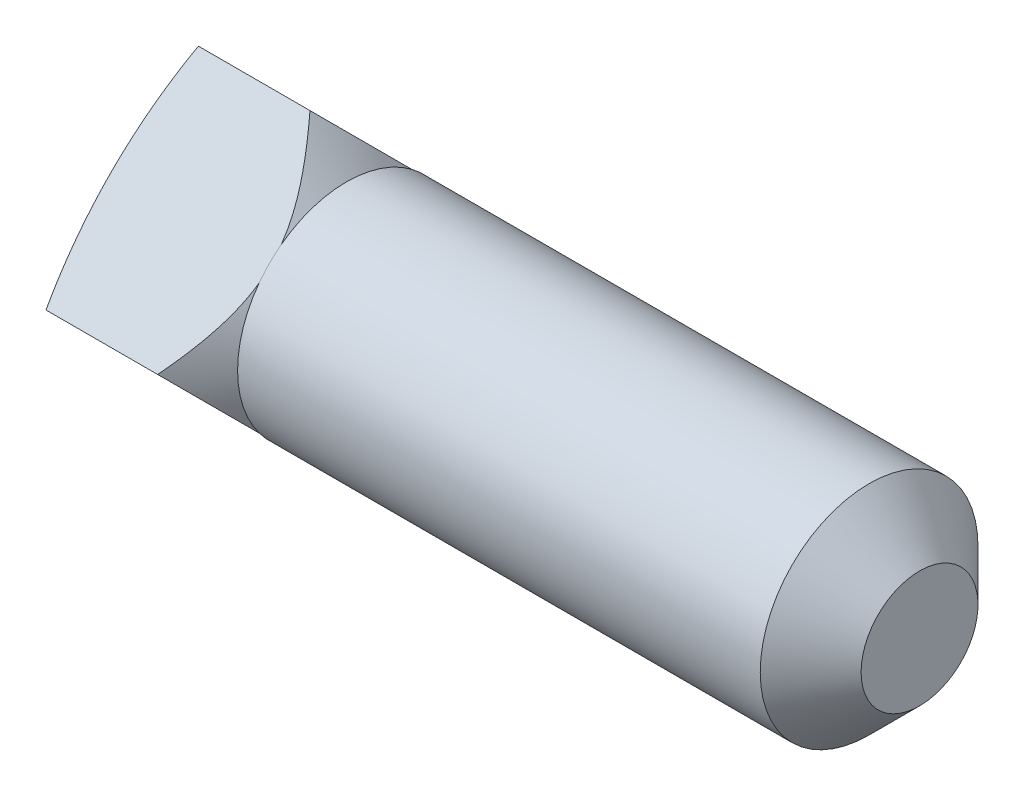
ISO-10303-21;
HEADER;
FILE_DESCRIPTION(('STEP AP214'),'2;1');
FILE_NAME('part.step','',(''),(''),'','','');
FILE_SCHEMA(('AUTOMOTIVE_DESIGN { 1 0 10303 214 1 1 1 1 }'));
ENDSEC;
DATA;
#1=APPLICATION_CONTEXT('core data for automotive mechanical design processes');
#2=APPLICATION_PROTOCOL_DEFINITION('international standard','automotive_design',2000,#1);
#3=PRODUCT_CONTEXT('',#1,'mechanical');
#4=PRODUCT('Part','Part','',(#3));
#5=PRODUCT_RELATED_PRODUCT_CATEGORY('part','',(#4));
#6=PRODUCT_DEFINITION_FORMATION('','',#4);
#7=PRODUCT_DEFINITION_CONTEXT('part definition',#1,'design');
#8=PRODUCT_DEFINITION('design','',#6,#7);
#9=PRODUCT_DEFINITION_SHAPE('','',#8);
#10=(LENGTH_UNIT() NAMED_UNIT(*) SI_UNIT(.MILLI.,.METRE.));
#11=(NAMED_UNIT(*) PLANE_ANGLE_UNIT() SI_UNIT($,.RADIAN.));
#12=(NAMED_UNIT(*) SI_UNIT($,.STERADIAN.) SOLID_ANGLE_UNIT());
#13=UNCERTAINTY_MEASURE_WITH_UNIT(LENGTH_MEASURE(1.E-05),#10,'distance_accuracy_value','');
#14=(GEOMETRIC_REPRESENTATION_CONTEXT(3) GLOBAL_UNCERTAINTY_ASSIGNED_CONTEXT((#13)) GLOBAL_UNIT_ASSIGNED_CONTEXT((#10,
#11,#12)) REPRESENTATION_CONTEXT('',''));
#15=CARTESIAN_POINT('',(0.,0.,0.));
#16=DIRECTION('',(0.,0.,1.));
#17=DIRECTION('',(1.,0.,0.));
#18=AXIS2_PLACEMENT_3D('',#15,#16,#17);
#19=CARTESIAN_POINT('',(-3.7592,0.,-3.376576301522));
#20=DIRECTION('',(0.,-0.707106781186549,0.707106781186546));
#21=DIRECTION('',(0.,-0.707106781186546,-0.707106781186549));
#22=AXIS2_PLACEMENT_3D('',#19,#20,#21);
#23=PLANE('',#22);
#24=CARTESIAN_POINT('',(-3.71463670391966,-2.84404188134762,-6.22061818286964));
#25=CARTESIAN_POINT('',(-3.55613835738032,-2.70146848632886,-6.07804478785087));
#26=CARTESIAN_POINT('',(-3.39814617256141,-2.55860959219919,-5.9351858937212));
#27=CARTESIAN_POINT('',(-3.08363247371535,-2.27203984223065,-5.64861614375266));
#28=CARTESIAN_POINT('',(-2.92711125800508,-2.12832882282155,-5.50490512434356));
#29=CARTESIAN_POINT('',(-2.61537743727247,-1.83919610910247,-5.21577241062448));
#30=CARTESIAN_POINT('',(-2.46017361078746,-1.6937696716646,-5.07034597318661));
#31=CARTESIAN_POINT('',(-2.15261018150917,-1.40143979481066,-4.77801609633267));
#32=CARTESIAN_POINT('',(-2.00025026783186,-1.25453651956936,-4.63111282109138));
#33=CARTESIAN_POINT('',(-1.72970912218959,-0.988182083810121,-4.36475838533213));
#34=CARTESIAN_POINT('',(-1.61078189630443,-0.86911118615792,-4.24568748767993));
#35=CARTESIAN_POINT('',(-1.37665028006826,-0.629105226352275,-4.00568152787428));
#36=CARTESIAN_POINT('',(-1.26144677859993,-0.508169729132252,-3.88474603065426));
#37=CARTESIAN_POINT('',(-1.03648369877532,-0.263755950580132,-3.64033225210214));
#38=CARTESIAN_POINT('',(-0.926724208648712,-0.140277628082998,-3.51685392960501));
#39=CARTESIAN_POINT('',(-0.768411771757131,0.0475823268501847,-3.32899397467182));
#40=CARTESIAN_POINT('',(-0.716703508322054,0.110632006865459,-3.26594429465655));
#41=CARTESIAN_POINT('',(-0.615958235242732,0.237786165781767,-3.13879013574024));
#42=CARTESIAN_POINT('',(-0.566920935267929,0.301890529049711,-3.0746857724723));
#43=CARTESIAN_POINT('',(-0.470564396194498,0.433616769365309,-2.9429595321567));
#44=CARTESIAN_POINT('',(-0.423365899696199,0.501283129317147,-2.87529317220486));
#45=CARTESIAN_POINT('',(-0.333664681644477,0.638144262361072,-2.73843203916093));
#46=CARTESIAN_POINT('',(-0.291160483356185,0.707338546531563,-2.66923775499044));
#47=CARTESIAN_POINT('',(-0.212295032056032,0.847303910790538,-2.52927239073147));
#48=CARTESIAN_POINT('',(-0.175920709426442,0.91807126243027,-2.45850503909173));
#49=CARTESIAN_POINT('',(-0.110910569940018,1.06137320930859,-2.31520309221341));
#50=CARTESIAN_POINT('',(-0.0822720790273647,1.13390718439996,-2.24266911712205));
#51=CARTESIAN_POINT('',(-0.0393755590361116,1.26582470943112,-2.11075159209088));
#52=CARTESIAN_POINT('',(-0.0233846612610396,1.32492428039636,-2.05165202112564));
#53=CARTESIAN_POINT('',(0.00161538214944963,1.44386018912421,-1.93271611239779));
#54=CARTESIAN_POINT('',(0.0106258990169553,1.50369637983724,-1.87287992168476));
#55=CARTESIAN_POINT('',(0.0210920652181361,1.62355655088548,-1.75301975063653));
#56=CARTESIAN_POINT('',(0.0225662852538808,1.68357970456731,-1.69299659695469));
#57=CARTESIAN_POINT('',(0.0179155629650313,1.80348109631522,-1.57309520520678));
#58=CARTESIAN_POINT('',(0.0117896392073258,1.86335931466476,-1.51321698685724));
#59=CARTESIAN_POINT('',(-0.010081522976217,1.99721927704992,-1.37935702447208));
#60=CARTESIAN_POINT('',(-0.027826477027307,2.07103738294235,-1.30553891857965));
#61=CARTESIAN_POINT('',(-0.0730208692286077,2.21718932171441,-1.15938697980758));
#62=CARTESIAN_POINT('',(-0.100477023647986,2.28952209061003,-1.08705421091197));
#63=CARTESIAN_POINT('',(-0.147658550765388,2.39694211918628,-0.979634182335721));
#64=CARTESIAN_POINT('',(-0.164455634065112,2.43269379192938,-0.943882509592619));
#65=CARTESIAN_POINT('',(-0.19981344104269,2.50374093804661,-0.872835363475388));
#66=CARTESIAN_POINT('',(-0.218373328077699,2.53903661889173,-0.837539682630273));
#67=CARTESIAN_POINT('',(-0.257053416617376,2.60919264030515,-0.767383661216851));
#68=CARTESIAN_POINT('',(-0.27717350565575,2.64405301204254,-0.732523289479463));
#69=CARTESIAN_POINT('',(-0.318791320846218,2.71336326090936,-0.663213040612643));
#70=CARTESIAN_POINT('',(-0.340289202341521,2.74781309122997,-0.628763210292031));
#71=CARTESIAN_POINT('',(-0.403215402660155,2.84534321177673,-0.531233089745269));
#72=CARTESIAN_POINT('',(-0.446099723650924,2.90795472792707,-0.468621573594927));
#73=CARTESIAN_POINT('',(-0.53512154372312,3.03201522266648,-0.344561078855519));
#74=CARTESIAN_POINT('',(-0.581259746295087,3.09346394619464,-0.283112355327361));
#75=CARTESIAN_POINT('',(-0.723571645103408,3.27639274740919,-0.100183554112801));
#76=CARTESIAN_POINT('',(-0.8235887438071,3.39637526634594,0.01979896482394));
#77=CARTESIAN_POINT('',(-1.03047356134509,3.63375592705876,0.25717962553677));
#78=CARTESIAN_POINT('',(-1.13735948771639,3.75114599014619,0.374569688624197));
#79=CARTESIAN_POINT('',(-1.35557896678471,3.98376603551795,0.607189733995958));
#80=CARTESIAN_POINT('',(-1.46691077768556,4.09899683825319,0.722420536731199));
#81=CARTESIAN_POINT('',(-1.6930561214528,4.328235026993,0.951658725471011));
#82=CARTESIAN_POINT('',(-1.80787896298781,4.44223779677277,1.06566149525078));
#83=CARTESIAN_POINT('',(-2.03983717113549,4.66907271742662,1.29249641590463));
#84=CARTESIAN_POINT('',(-2.15697273510506,4.78190476713263,1.40532846561064));
#85=CARTESIAN_POINT('',(-2.3927971247126,5.0065028649931,1.62992656347111));
#86=CARTESIAN_POINT('',(-2.51148349733143,5.11827020377548,1.74169390225349));
#87=CARTESIAN_POINT('',(-2.75017246375112,5.34109999204865,1.96452369052666));
#88=CARTESIAN_POINT('',(-2.87017506440524,5.45216243786449,2.0755861363425));
#89=CARTESIAN_POINT('',(-3.05068333501736,5.61808795816616,2.24151165664417));
#90=CARTESIAN_POINT('',(-3.11080136898754,5.67316227631965,2.29658597479766));
#91=CARTESIAN_POINT('',(-3.23127854688772,5.78319708269378,2.40662078117179));
#92=CARTESIAN_POINT('',(-3.29163773795256,5.83815754511737,2.46158124359538));
#93=CARTESIAN_POINT('',(-3.41233885436029,5.94776482135297,2.57118851983098));
#94=CARTESIAN_POINT('',(-3.47268003281193,6.00241204656917,2.62583574504718));
#95=CARTESIAN_POINT('',(-3.5935326081361,6.11159399323981,2.73501769171782));
#96=CARTESIAN_POINT('',(-3.65404396700811,6.16612873572363,2.78955243420165));
#97=CARTESIAN_POINT('',(-3.71463670391966,6.22061818286963,2.84404188134764));
#98=B_SPLINE_CURVE_WITH_KNOTS('',3,(#24,#25,#26,#27,#28,#29,#30,#31,#32,#33,#34,#35,#36,#37,#38,
#39,#40,#41,#42,#43,#44,#45,#46,#47,#48,#49,#50,#51,#52,#53,#54,#55,#56,#57,#58,#59,#60,#61,#62,
#63,#64,#65,#66,#67,#68,#69,#70,#71,#72,#73,#74,#75,#76,#77,#78,#79,#80,#81,#82,#83,#84,#85,#86,
#87,#88,#89,#90,#91,#92,#93,#94,#95,#96,#97),.UNSPECIFIED.,.F.,.F.,(4,2,2,2,2,2,2,2,2,2,2,2,2,2,
2,2,2,2,2,2,2,2,2,2,2,2,2,2,2,2,2,2,2,2,2,2,4),(0.,0.769411594985038,1.53897600020601,
2.31192373762501,3.08478647901887,3.70321119591569,4.32178246157391,4.94036374898185,
5.24955145783669,5.55870549100773,5.87871228162835,6.19861811586583,6.51783299840484,
6.83693739586911,7.0919662684173,7.3469450301598,7.60129517747015,7.85567817332229,
8.17279662746602,8.4901348310597,8.64994152137456,8.80967274140033,8.96939245797416,
9.1291302143996,9.42418817492722,9.71931012383256,10.3099299987712,10.9021857726153,
11.4942117478053,12.0879855523362,12.6818102476387,13.2747881880482,13.8677692174049,
14.1629380958067,14.4581678026873,14.7523159011577,15.0464028402098),.UNSPECIFIED.);
#99=CARTESIAN_POINT('',(-0.80853651921829,0.,-3.376576301522));
#100=VERTEX_POINT('',#99);
#101=CARTESIAN_POINT('',(0.,1.44137193015166,-1.93520437137034));
#102=VERTEX_POINT('',#101);
#103=EDGE_CURVE('E156',#100,#102,#98,.T.);
#104=ORIENTED_EDGE('',*,*,#103,.F.);
#105=DIRECTION('',(1.,0.,0.));
#106=VECTOR('',#105,1.);
#107=CARTESIAN_POINT('',(-3.7592,0.,-3.376576301522));
#108=LINE('',#107,#106);
#109=CARTESIAN_POINT('',(-3.2823012150984,0.,-3.376576301522));
#110=VERTEX_POINT('',#109);
#111=EDGE_CURVE('E137',#110,#100,#108,.T.);
#112=ORIENTED_EDGE('',*,*,#111,.F.);
#113=CARTESIAN_POINT('',(8.4328,1.688288150761,-1.688288150761));
#114=DIRECTION('',(0.,-0.707106781186549,0.707106781186546));
#115=DIRECTION('',(0.,-0.707106781186546,-0.707106781186549));
#116=AXIS2_PLACEMENT_3D('',#113,#114,#115);
#117=CIRCLE('',#116,11.9559286648926);
#118=CARTESIAN_POINT('',(-3.2823012150984,3.376576301522,0.));
#119=VERTEX_POINT('',#118);
#120=EDGE_CURVE('E146',#119,#110,#117,.T.);
#121=ORIENTED_EDGE('',*,*,#120,.F.);
#122=DIRECTION('',(1.,0.,0.));
#123=VECTOR('',#122,1.);
#124=CARTESIAN_POINT('',(-3.7592,3.376576301522,0.));
#125=LINE('',#124,#123);
#126=CARTESIAN_POINT('',(-0.80853651921829,3.376576301522,0.));
#127=VERTEX_POINT('',#126);
#128=EDGE_CURVE('E144',#119,#127,#125,.T.);
#129=ORIENTED_EDGE('',*,*,#128,.T.);
#130=CARTESIAN_POINT('',(0.,1.93520437137034,-1.44137193015166));
#131=VERTEX_POINT('',#130);
#132=EDGE_CURVE('E166',#131,#127,#98,.T.);
#133=ORIENTED_EDGE('',*,*,#132,.F.);
#134=DIRECTION('',(0.,-0.707106781186546,-0.707106781186549));
#135=VECTOR('',#134,1.);
#136=CARTESIAN_POINT('',(0.,0.,-3.376576301522));
#137=LINE('',#136,#135);
#138=EDGE_CURVE('E40',#131,#102,#137,.T.);
#139=ORIENTED_EDGE('',*,*,#138,.T.);
#140=EDGE_LOOP('',(#104,#112,#121,#129,#133,#139));
#141=FACE_BOUND('',#140,.T.);
#142=ADVANCED_FACE('F32',(#141),#23,.F.);
#143=CARTESIAN_POINT('',(-3.7592,0.,-3.376576301522));
#144=DIRECTION('',(0.,0.707106781186546,0.707106781186549));
#145=DIRECTION('',(0.,-0.707106781186549,0.707106781186546));
#146=AXIS2_PLACEMENT_3D('',#143,#144,#145);
#147=PLANE('',#146);
#148=CARTESIAN_POINT('',(-3.71463670391966,-6.22061818286964,2.84404188134762));
#149=CARTESIAN_POINT('',(-3.55613835738032,-6.07804478785087,2.70146848632886));
#150=CARTESIAN_POINT('',(-3.39814617256141,-5.9351858937212,2.55860959219919));
#151=CARTESIAN_POINT('',(-3.08363247371535,-5.64861614375266,2.27203984223065));
#152=CARTESIAN_POINT('',(-2.92711125800508,-5.50490512434356,2.12832882282155));
#153=CARTESIAN_POINT('',(-2.61537743727247,-5.21577241062448,1.83919610910247));
#154=CARTESIAN_POINT('',(-2.46017361078746,-5.07034597318661,1.6937696716646));
#155=CARTESIAN_POINT('',(-2.15261018150917,-4.77801609633267,1.40143979481066));
#156=CARTESIAN_POINT('',(-2.00025026783186,-4.63111282109137,1.25453651956936));
#157=CARTESIAN_POINT('',(-1.72970912218959,-4.36475838533213,0.988182083810121));
#158=CARTESIAN_POINT('',(-1.61078189630443,-4.24568748767993,0.86911118615792));
#159=CARTESIAN_POINT('',(-1.37665028006826,-4.00568152787428,0.629105226352275));
#160=CARTESIAN_POINT('',(-1.26144677859993,-3.88474603065426,0.508169729132252));
#161=CARTESIAN_POINT('',(-1.03648369877532,-3.64033225210214,0.263755950580132));
#162=CARTESIAN_POINT('',(-0.926724208648712,-3.51685392960501,0.140277628082998));
#163=CARTESIAN_POINT('',(-0.76841177175713,-3.32899397467182,-0.0475823268501848));
#164=CARTESIAN_POINT('',(-0.716703508322053,-3.26594429465655,-0.11063200686546));
#165=CARTESIAN_POINT('',(-0.615958235242732,-3.13879013574024,-0.237786165781768));
#166=CARTESIAN_POINT('',(-0.566920935267929,-3.0746857724723,-0.301890529049712));
#167=CARTESIAN_POINT('',(-0.470564396194498,-2.9429595321567,-0.433616769365309));
#168=CARTESIAN_POINT('',(-0.423365899696199,-2.87529317220486,-0.501283129317148));
#169=CARTESIAN_POINT('',(-0.333664681644478,-2.73843203916093,-0.638144262361073));
#170=CARTESIAN_POINT('',(-0.291160483356186,-2.66923775499044,-0.707338546531564));
#171=CARTESIAN_POINT('',(-0.212295032056033,-2.52927239073147,-0.847303910790538));
#172=CARTESIAN_POINT('',(-0.175920709426442,-2.45850503909173,-0.91807126243027));
#173=CARTESIAN_POINT('',(-0.110910569940019,-2.31520309221341,-1.06137320930859));
#174=CARTESIAN_POINT('',(-0.0822720790273651,-2.24266911712205,-1.13390718439996));
#175=CARTESIAN_POINT('',(-0.0393755590361117,-2.11075159209088,-1.26582470943112));
#176=CARTESIAN_POINT('',(-0.0233846612610394,-2.05165202112564,-1.32492428039636));
#177=CARTESIAN_POINT('',(0.00161538214944984,-1.93271611239779,-1.44386018912421));
#178=CARTESIAN_POINT('',(0.0106258990169552,-1.87287992168476,-1.50369637983724));
#179=CARTESIAN_POINT('',(0.0210920652181359,-1.75301975063653,-1.62355655088548));
#180=CARTESIAN_POINT('',(0.0225662852538808,-1.69299659695469,-1.68357970456731));
#181=CARTESIAN_POINT('',(0.0179155629650313,-1.57309520520678,-1.80348109631522));
#182=CARTESIAN_POINT('',(0.0117896392073257,-1.51321698685724,-1.86335931466476));
#183=CARTESIAN_POINT('',(-0.0100815229762172,-1.37935702447208,-1.99721927704992));
#184=CARTESIAN_POINT('',(-0.0278264770273069,-1.30553891857965,-2.07103738294235));
#185=CARTESIAN_POINT('',(-0.0730208692286075,-1.15938697980759,-2.21718932171441));
#186=CARTESIAN_POINT('',(-0.100477023647986,-1.08705421091197,-2.28952209061003));
#187=CARTESIAN_POINT('',(-0.147658550765387,-0.979634182335723,-2.39694211918628));
#188=CARTESIAN_POINT('',(-0.164455634065112,-0.94388250959262,-2.43269379192938));
#189=CARTESIAN_POINT('',(-0.19981344104269,-0.87283536347539,-2.50374093804661));
#190=CARTESIAN_POINT('',(-0.218373328077698,-0.837539682630274,-2.53903661889172));
#191=CARTESIAN_POINT('',(-0.257053416617376,-0.767383661216851,-2.60919264030515));
#192=CARTESIAN_POINT('',(-0.27717350565575,-0.732523289479463,-2.64405301204254));
#193=CARTESIAN_POINT('',(-0.318791320846218,-0.663213040612644,-2.71336326090935));
#194=CARTESIAN_POINT('',(-0.340289202341521,-0.628763210292032,-2.74781309122997));
#195=CARTESIAN_POINT('',(-0.403215402660155,-0.53123308974527,-2.84534321177673));
#196=CARTESIAN_POINT('',(-0.446099723650924,-0.468621573594928,-2.90795472792707));
#197=CARTESIAN_POINT('',(-0.535121543723119,-0.34456107885552,-3.03201522266648));
#198=CARTESIAN_POINT('',(-0.581259746295085,-0.283112355327362,-3.09346394619464));
#199=CARTESIAN_POINT('',(-0.723571645103405,-0.100183554112803,-3.27639274740919));
#200=CARTESIAN_POINT('',(-0.823588743807098,0.0197989648239375,-3.39637526634593));
#201=CARTESIAN_POINT('',(-1.03047356134509,0.257179625536766,-3.63375592705876));
#202=CARTESIAN_POINT('',(-1.13735948771639,0.374569688624193,-3.75114599014619));
#203=CARTESIAN_POINT('',(-1.35557896678471,0.607189733995953,-3.98376603551795));
#204=CARTESIAN_POINT('',(-1.46691077768556,0.722420536731195,-4.09899683825319));
#205=CARTESIAN_POINT('',(-1.69305612145279,0.951658725471007,-4.328235026993));
#206=CARTESIAN_POINT('',(-1.80787896298781,1.06566149525078,-4.44223779677277));
#207=CARTESIAN_POINT('',(-2.03983717113549,1.29249641590462,-4.66907271742661));
#208=CARTESIAN_POINT('',(-2.15697273510505,1.40532846561063,-4.78190476713262));
#209=CARTESIAN_POINT('',(-2.3927971247126,1.62992656347111,-5.0065028649931));
#210=CARTESIAN_POINT('',(-2.51148349733142,1.74169390225349,-5.11827020377548));
#211=CARTESIAN_POINT('',(-2.75017246375112,1.96452369052666,-5.34109999204865));
#212=CARTESIAN_POINT('',(-2.87017506440524,2.07558613634249,-5.45216243786448));
#213=CARTESIAN_POINT('',(-3.05068333501736,2.24151165664417,-5.61808795816615));
#214=CARTESIAN_POINT('',(-3.11080136898754,2.29658597479765,-5.67316227631964));
#215=CARTESIAN_POINT('',(-3.23127854688771,2.40662078117179,-5.78319708269378));
#216=CARTESIAN_POINT('',(-3.29163773795256,2.46158124359538,-5.83815754511737));
#217=CARTESIAN_POINT('',(-3.41233885436029,2.57118851983098,-5.94776482135297));
#218=CARTESIAN_POINT('',(-3.47268003281193,2.62583574504718,-6.00241204656917));
#219=CARTESIAN_POINT('',(-3.59353260813609,2.73501769171782,-6.11159399323981));
#220=CARTESIAN_POINT('',(-3.65404396700811,2.78955243420165,-6.16612873572363));
#221=CARTESIAN_POINT('',(-3.71463670391966,2.84404188134764,-6.22061818286963));
#222=B_SPLINE_CURVE_WITH_KNOTS('',3,(#148,#149,#150,#151,#152,#153,#154,#155,#156,#157,#158,
#159,#160,#161,#162,#163,#164,#165,#166,#167,#168,#169,#170,#171,#172,#173,#174,#175,#176,#177,
#178,#179,#180,#181,#182,#183,#184,#185,#186,#187,#188,#189,#190,#191,#192,#193,#194,#195,#196,
#197,#198,#199,#200,#201,#202,#203,#204,#205,#206,#207,#208,#209,#210,#211,#212,#213,#214,#215,
#216,#217,#218,#219,#220,#221),.UNSPECIFIED.,.F.,.F.,(4,2,2,2,2,2,2,2,2,2,2,2,2,2,2,2,2,2,2,2,2,
2,2,2,2,2,2,2,2,2,2,2,2,2,2,2,4),(0.,0.769411594985037,1.53897600020601,2.31192373762501,
3.08478647901887,3.70321119591569,4.32178246157391,4.94036374898185,5.24955145783669,
5.55870549100773,5.87871228162835,6.19861811586583,6.51783299840484,6.83693739586911,
7.0919662684173,7.3469450301598,7.60129517747015,7.85567817332229,8.17279662746602,
8.4901348310597,8.64994152137456,8.80967274140033,8.96939245797415,9.1291302143996,
9.42418817492722,9.71931012383256,10.3099299987712,10.9021857726153,11.4942117478053,
12.0879855523362,12.6818102476387,13.2747881880482,13.8677692174049,14.1629380958067,
14.4581678026873,14.7523159011577,15.0464028402098),.UNSPECIFIED.);
#223=CARTESIAN_POINT('',(-0.80853651921829,-3.376576301522,0.));
#224=VERTEX_POINT('',#223);
#225=CARTESIAN_POINT('',(0.,-1.93520437137034,-1.44137193015166));
#226=VERTEX_POINT('',#225);
#227=EDGE_CURVE('E157',#224,#226,#222,.T.);
#228=ORIENTED_EDGE('',*,*,#227,.F.);
#229=DIRECTION('',(1.,0.,0.));
#230=VECTOR('',#229,1.);
#231=CARTESIAN_POINT('',(-3.7592,-3.376576301522,0.));
#232=LINE('',#231,#230);
#233=CARTESIAN_POINT('',(-3.2823012150984,-3.376576301522,0.));
#234=VERTEX_POINT('',#233);
#235=EDGE_CURVE('E140',#234,#224,#232,.T.);
#236=ORIENTED_EDGE('',*,*,#235,.F.);
#237=CARTESIAN_POINT('',(8.4328,-1.688288150761,-1.688288150761));
#238=DIRECTION('',(0.,0.707106781186546,0.707106781186549));
#239=DIRECTION('',(0.,-0.707106781186549,0.707106781186546));
#240=AXIS2_PLACEMENT_3D('',#237,#238,#239);
#241=CIRCLE('',#240,11.9559286648926);
#242=EDGE_CURVE('E153',#110,#234,#241,.T.);
#243=ORIENTED_EDGE('',*,*,#242,.F.);
#244=ORIENTED_EDGE('',*,*,#111,.T.);
#245=CARTESIAN_POINT('',(0.,-1.44137193015166,-1.93520437137034));
#246=VERTEX_POINT('',#245);
#247=EDGE_CURVE('E164',#246,#100,#222,.T.);
#248=ORIENTED_EDGE('',*,*,#247,.F.);
#249=DIRECTION('',(0.,-0.707106781186549,0.707106781186546));
#250=VECTOR('',#249,1.);
#251=CARTESIAN_POINT('',(0.,0.,-3.376576301522));
#252=LINE('',#251,#250);
#253=EDGE_CURVE('E127',#246,#226,#252,.T.);
#254=ORIENTED_EDGE('',*,*,#253,.T.);
#255=EDGE_LOOP('',(#228,#236,#243,#244,#248,#254));
#256=FACE_BOUND('',#255,.T.);
#257=ADVANCED_FACE('F172',(#256),#147,.F.);
#258=CARTESIAN_POINT('',(-3.7592,-3.376576301522,0.));
#259=DIRECTION('',(0.,0.707106781186549,-0.707106781186546));
#260=DIRECTION('',(0.,0.707106781186546,0.707106781186549));
#261=AXIS2_PLACEMENT_3D('',#258,#259,#260);
#262=PLANE('',#261);
#263=CARTESIAN_POINT('',(-3.71463670391966,2.84404188134762,6.22061818286964));
#264=CARTESIAN_POINT('',(-3.55613835738032,2.70146848632886,6.07804478785087));
#265=CARTESIAN_POINT('',(-3.39814617256141,2.55860959219919,5.9351858937212));
#266=CARTESIAN_POINT('',(-3.08363247371535,2.27203984223065,5.64861614375266));
#267=CARTESIAN_POINT('',(-2.92711125800508,2.12832882282155,5.50490512434356));
#268=CARTESIAN_POINT('',(-2.61537743727247,1.83919610910247,5.21577241062448));
#269=CARTESIAN_POINT('',(-2.46017361078746,1.6937696716646,5.07034597318661));
#270=CARTESIAN_POINT('',(-2.15261018150917,1.40143979481066,4.77801609633267));
#271=CARTESIAN_POINT('',(-2.00025026783186,1.25453651956936,4.63111282109138));
#272=CARTESIAN_POINT('',(-1.72970912218959,0.988182083810121,4.36475838533213));
#273=CARTESIAN_POINT('',(-1.61078189630443,0.86911118615792,4.24568748767993));
#274=CARTESIAN_POINT('',(-1.37665028006826,0.629105226352275,4.00568152787428));
#275=CARTESIAN_POINT('',(-1.26144677859993,0.508169729132252,3.88474603065426));
#276=CARTESIAN_POINT('',(-1.03648369877532,0.263755950580132,3.64033225210214));
#277=CARTESIAN_POINT('',(-0.926724208648713,0.140277628082997,3.51685392960501));
#278=CARTESIAN_POINT('',(-0.768411771757132,-0.0475823268501847,3.32899397467182));
#279=CARTESIAN_POINT('',(-0.716703508322054,-0.110632006865459,3.26594429465655));
#280=CARTESIAN_POINT('',(-0.615958235242733,-0.237786165781767,3.13879013574024));
#281=CARTESIAN_POINT('',(-0.56692093526793,-0.301890529049711,3.0746857724723));
#282=CARTESIAN_POINT('',(-0.470564396194499,-0.433616769365309,2.9429595321567));
#283=CARTESIAN_POINT('',(-0.4233658996962,-0.501283129317147,2.87529317220486));
#284=CARTESIAN_POINT('',(-0.333664681644478,-0.638144262361072,2.73843203916093));
#285=CARTESIAN_POINT('',(-0.291160483356186,-0.707338546531562,2.66923775499044));
#286=CARTESIAN_POINT('',(-0.212295032056033,-0.847303910790537,2.52927239073147));
#287=CARTESIAN_POINT('',(-0.175920709426443,-0.918071262430268,2.45850503909174));
#288=CARTESIAN_POINT('',(-0.110910569940019,-1.06137320930859,2.31520309221341));
#289=CARTESIAN_POINT('',(-0.0822720790273654,-1.13390718439996,2.24266911712205));
#290=CARTESIAN_POINT('',(-0.039375559036112,-1.26582470943112,2.11075159209088));
#291=CARTESIAN_POINT('',(-0.0233846612610399,-1.32492428039636,2.05165202112564));
#292=CARTESIAN_POINT('',(0.00161538214944944,-1.44386018912421,1.93271611239779));
#293=CARTESIAN_POINT('',(0.0106258990169551,-1.50369637983724,1.87287992168476));
#294=CARTESIAN_POINT('',(0.021092065218136,-1.62355655088547,1.75301975063653));
#295=CARTESIAN_POINT('',(0.0225662852538807,-1.68357970456731,1.69299659695469));
#296=CARTESIAN_POINT('',(0.0179155629650313,-1.80348109631522,1.57309520520678));
#297=CARTESIAN_POINT('',(0.0117896392073257,-1.86335931466476,1.51321698685724));
#298=CARTESIAN_POINT('',(-0.010081522976217,-1.99721927704992,1.37935702447208));
#299=CARTESIAN_POINT('',(-0.0278264770273068,-2.07103738294234,1.30553891857966));
#300=CARTESIAN_POINT('',(-0.0730208692286073,-2.21718932171441,1.15938697980759));
#301=CARTESIAN_POINT('',(-0.100477023647986,-2.28952209061003,1.08705421091197));
#302=CARTESIAN_POINT('',(-0.147658550765387,-2.39694211918628,0.979634182335724));
#303=CARTESIAN_POINT('',(-0.164455634065111,-2.43269379192938,0.943882509592622));
#304=CARTESIAN_POINT('',(-0.199813441042689,-2.50374093804661,0.872835363475391));
#305=CARTESIAN_POINT('',(-0.218373328077698,-2.53903661889172,0.837539682630276));
#306=CARTESIAN_POINT('',(-0.257053416617376,-2.60919264030515,0.767383661216852));
#307=CARTESIAN_POINT('',(-0.27717350565575,-2.64405301204253,0.732523289479464));
#308=CARTESIAN_POINT('',(-0.318791320846217,-2.71336326090935,0.663213040612644));
#309=CARTESIAN_POINT('',(-0.340289202341521,-2.74781309122997,0.628763210292032));
#310=CARTESIAN_POINT('',(-0.403215402660155,-2.84534321177673,0.53123308974527));
#311=CARTESIAN_POINT('',(-0.446099723650923,-2.90795472792707,0.468621573594928));
#312=CARTESIAN_POINT('',(-0.535121543723119,-3.03201522266648,0.344561078855519));
#313=CARTESIAN_POINT('',(-0.581259746295086,-3.09346394619464,0.283112355327361));
#314=CARTESIAN_POINT('',(-0.723571645103406,-3.27639274740919,0.100183554112802));
#315=CARTESIAN_POINT('',(-0.823588743807099,-3.39637526634593,-0.0197989648239387));
#316=CARTESIAN_POINT('',(-1.03047356134509,-3.63375592705876,-0.257179625536767));
#317=CARTESIAN_POINT('',(-1.13735948771639,-3.75114599014619,-0.374569688624194));
#318=CARTESIAN_POINT('',(-1.35557896678471,-3.98376603551795,-0.607189733995955));
#319=CARTESIAN_POINT('',(-1.46691077768556,-4.09899683825319,-0.722420536731197));
#320=CARTESIAN_POINT('',(-1.6930561214528,-4.328235026993,-0.951658725471009));
#321=CARTESIAN_POINT('',(-1.80787896298781,-4.44223779677277,-1.06566149525078));
#322=CARTESIAN_POINT('',(-2.03983717113549,-4.66907271742662,-1.29249641590462));
#323=CARTESIAN_POINT('',(-2.15697273510505,-4.78190476713262,-1.40532846561063));
#324=CARTESIAN_POINT('',(-2.3927971247126,-5.0065028649931,-1.62992656347111));
#325=CARTESIAN_POINT('',(-2.51148349733143,-5.11827020377548,-1.74169390225349));
#326=CARTESIAN_POINT('',(-2.75017246375112,-5.34109999204865,-1.96452369052666));
#327=CARTESIAN_POINT('',(-2.87017506440524,-5.45216243786449,-2.0755861363425));
#328=CARTESIAN_POINT('',(-3.05068333501736,-5.61808795816615,-2.24151165664417));
#329=CARTESIAN_POINT('',(-3.11080136898754,-5.67316227631964,-2.29658597479766));
#330=CARTESIAN_POINT('',(-3.23127854688772,-5.78319708269378,-2.40662078117179));
#331=CARTESIAN_POINT('',(-3.29163773795256,-5.83815754511737,-2.46158124359538));
#332=CARTESIAN_POINT('',(-3.41233885436029,-5.94776482135297,-2.57118851983099));
#333=CARTESIAN_POINT('',(-3.47268003281193,-6.00241204656917,-2.62583574504718));
#334=CARTESIAN_POINT('',(-3.5935326081361,-6.11159399323981,-2.73501769171782));
#335=CARTESIAN_POINT('',(-3.65404396700811,-6.16612873572363,-2.78955243420165));
#336=CARTESIAN_POINT('',(-3.71463670391966,-6.22061818286963,-2.84404188134764));
#337=B_SPLINE_CURVE_WITH_KNOTS('',3,(#263,#264,#265,#266,#267,#268,#269,#270,#271,#272,#273,
#274,#275,#276,#277,#278,#279,#280,#281,#282,#283,#284,#285,#286,#287,#288,#289,#290,#291,#292,
#293,#294,#295,#296,#297,#298,#299,#300,#301,#302,#303,#304,#305,#306,#307,#308,#309,#310,#311,
#312,#313,#314,#315,#316,#317,#318,#319,#320,#321,#322,#323,#324,#325,#326,#327,#328,#329,#330,
#331,#332,#333,#334,#335,#336),.UNSPECIFIED.,.F.,.F.,(4,2,2,2,2,2,2,2,2,2,2,2,2,2,2,2,2,2,2,2,2,
2,2,2,2,2,2,2,2,2,2,2,2,2,2,2,4),(0.,0.769411594985037,1.53897600020601,2.31192373762501,
3.08478647901887,3.70321119591569,4.32178246157391,4.94036374898185,5.24955145783668,
5.55870549100773,5.87871228162835,6.19861811586582,6.51783299840483,6.83693739586911,
7.0919662684173,7.3469450301598,7.60129517747015,7.85567817332229,8.17279662746601,
8.4901348310597,8.64994152137456,8.80967274140032,8.96939245797415,9.12913021439959,
9.42418817492722,9.71931012383256,10.3099299987712,10.9021857726153,11.4942117478053,
12.0879855523362,12.6818102476387,13.2747881880482,13.8677692174049,14.1629380958067,
14.4581678026873,14.7523159011577,15.0464028402098),.UNSPECIFIED.);
#338=CARTESIAN_POINT('',(-0.80853651921829,0.,3.376576301522));
#339=VERTEX_POINT('',#338);
#340=CARTESIAN_POINT('',(0.,-1.44137193015166,1.93520437137034));
#341=VERTEX_POINT('',#340);
#342=EDGE_CURVE('E54',#339,#341,#337,.T.);
#343=ORIENTED_EDGE('',*,*,#342,.F.);
#344=DIRECTION('',(1.,0.,0.));
#345=VECTOR('',#344,1.);
#346=CARTESIAN_POINT('',(-3.7592,0.,3.376576301522));
#347=LINE('',#346,#345);
#348=CARTESIAN_POINT('',(-3.2823012150984,0.,3.376576301522));
#349=VERTEX_POINT('',#348);
#350=EDGE_CURVE('E115',#349,#339,#347,.T.);
#351=ORIENTED_EDGE('',*,*,#350,.F.);
#352=CARTESIAN_POINT('',(8.4328,-1.688288150761,1.688288150761));
#353=DIRECTION('',(0.,0.707106781186549,-0.707106781186546));
#354=DIRECTION('',(0.,0.707106781186546,0.707106781186549));
#355=AXIS2_PLACEMENT_3D('',#352,#353,#354);
#356=CIRCLE('',#355,11.9559286648926);
#357=EDGE_CURVE('E46',#234,#349,#356,.T.);
#358=ORIENTED_EDGE('',*,*,#357,.F.);
#359=ORIENTED_EDGE('',*,*,#235,.T.);
#360=CARTESIAN_POINT('',(0.,-1.93520437137034,1.44137193015166));
#361=VERTEX_POINT('',#360);
#362=EDGE_CURVE('E165',#361,#224,#337,.T.);
#363=ORIENTED_EDGE('',*,*,#362,.F.);
#364=DIRECTION('',(0.,0.707106781186546,0.707106781186549));
#365=VECTOR('',#364,1.);
#366=CARTESIAN_POINT('',(0.,-3.376576301522,0.));
#367=LINE('',#366,#365);
#368=EDGE_CURVE('E121',#361,#341,#367,.T.);
#369=ORIENTED_EDGE('',*,*,#368,.T.);
#370=EDGE_LOOP('',(#343,#351,#358,#359,#363,#369));
#371=FACE_BOUND('',#370,.T.);
#372=ADVANCED_FACE('F193',(#371),#262,.F.);
#373=CARTESIAN_POINT('',(-3.7592,3.376576301522,0.));
#374=DIRECTION('',(0.,-0.707106781186546,-0.707106781186549));
#375=DIRECTION('',(0.,0.707106781186549,-0.707106781186546));
#376=AXIS2_PLACEMENT_3D('',#373,#374,#375);
#377=PLANE('',#376);
#378=CARTESIAN_POINT('',(-3.71463670391966,6.22061818286964,-2.84404188134762));
#379=CARTESIAN_POINT('',(-3.55613835738032,6.07804478785087,-2.70146848632886));
#380=CARTESIAN_POINT('',(-3.39814617256141,5.9351858937212,-2.55860959219919));
#381=CARTESIAN_POINT('',(-3.08363247371535,5.64861614375266,-2.27203984223065));
#382=CARTESIAN_POINT('',(-2.92711125800508,5.50490512434356,-2.12832882282155));
#383=CARTESIAN_POINT('',(-2.61537743727247,5.21577241062448,-1.83919610910247));
#384=CARTESIAN_POINT('',(-2.46017361078746,5.07034597318661,-1.6937696716646));
#385=CARTESIAN_POINT('',(-2.15261018150917,4.77801609633267,-1.40143979481066));
#386=CARTESIAN_POINT('',(-2.00025026783186,4.63111282109138,-1.25453651956936));
#387=CARTESIAN_POINT('',(-1.72970912218959,4.36475838533213,-0.988182083810121));
#388=CARTESIAN_POINT('',(-1.61078189630443,4.24568748767993,-0.86911118615792));
#389=CARTESIAN_POINT('',(-1.37665028006826,4.00568152787429,-0.629105226352276));
#390=CARTESIAN_POINT('',(-1.26144677859993,3.88474603065426,-0.508169729132253));
#391=CARTESIAN_POINT('',(-1.03648369877532,3.64033225210214,-0.263755950580134));
#392=CARTESIAN_POINT('',(-0.926724208648713,3.51685392960501,-0.140277628082999));
#393=CARTESIAN_POINT('',(-0.768411771757132,3.32899397467182,0.0475823268501832));
#394=CARTESIAN_POINT('',(-0.716703508322055,3.26594429465655,0.110632006865458));
#395=CARTESIAN_POINT('',(-0.615958235242733,3.13879013574024,0.237786165781766));
#396=CARTESIAN_POINT('',(-0.56692093526793,3.0746857724723,0.301890529049709));
#397=CARTESIAN_POINT('',(-0.470564396194499,2.9429595321567,0.433616769365307));
#398=CARTESIAN_POINT('',(-0.4233658996962,2.87529317220486,0.501283129317145));
#399=CARTESIAN_POINT('',(-0.333664681644478,2.73843203916093,0.638144262361071));
#400=CARTESIAN_POINT('',(-0.291160483356186,2.66923775499044,0.707338546531561));
#401=CARTESIAN_POINT('',(-0.212295032056033,2.52927239073147,0.847303910790536));
#402=CARTESIAN_POINT('',(-0.175920709426443,2.45850503909174,0.918071262430268));
#403=CARTESIAN_POINT('',(-0.110910569940019,2.31520309221341,1.06137320930859));
#404=CARTESIAN_POINT('',(-0.0822720790273651,2.24266911712205,1.13390718439996));
#405=CARTESIAN_POINT('',(-0.0393755590361119,2.11075159209089,1.26582470943112));
#406=CARTESIAN_POINT('',(-0.0233846612610399,2.05165202112564,1.32492428039636));
#407=CARTESIAN_POINT('',(0.00161538214944932,1.93271611239779,1.44386018912421));
#408=CARTESIAN_POINT('',(0.010625899016955,1.87287992168476,1.50369637983724));
#409=CARTESIAN_POINT('',(0.0210920652181359,1.75301975063653,1.62355655088547));
#410=CARTESIAN_POINT('',(0.0225662852538808,1.69299659695469,1.68357970456731));
#411=CARTESIAN_POINT('',(0.0179155629650316,1.57309520520678,1.80348109631522));
#412=CARTESIAN_POINT('',(0.0117896392073262,1.51321698685724,1.86335931466476));
#413=CARTESIAN_POINT('',(-0.0100815229762167,1.37935702447208,1.99721927704992));
#414=CARTESIAN_POINT('',(-0.0278264770273069,1.30553891857966,2.07103738294234));
#415=CARTESIAN_POINT('',(-0.0730208692286071,1.15938697980759,2.21718932171441));
#416=CARTESIAN_POINT('',(-0.100477023647985,1.08705421091198,2.28952209061002));
#417=CARTESIAN_POINT('',(-0.147658550765386,0.979634182335725,2.39694211918627));
#418=CARTESIAN_POINT('',(-0.16445563406511,0.943882509592623,2.43269379192938));
#419=CARTESIAN_POINT('',(-0.199813441042688,0.872835363475393,2.50374093804661));
#420=CARTESIAN_POINT('',(-0.218373328077696,0.837539682630278,2.53903661889172));
#421=CARTESIAN_POINT('',(-0.257053416617374,0.767383661216855,2.60919264030514));
#422=CARTESIAN_POINT('',(-0.277173505655749,0.732523289479466,2.64405301204253));
#423=CARTESIAN_POINT('',(-0.318791320846216,0.663213040612647,2.71336326090935));
#424=CARTESIAN_POINT('',(-0.340289202341519,0.628763210292035,2.74781309122996));
#425=CARTESIAN_POINT('',(-0.403215402660153,0.531233089745272,2.84534321177673));
#426=CARTESIAN_POINT('',(-0.446099723650922,0.46862157359493,2.90795472792707));
#427=CARTESIAN_POINT('',(-0.535121543723117,0.344561078855522,3.03201522266647));
#428=CARTESIAN_POINT('',(-0.581259746295084,0.283112355327364,3.09346394619463));
#429=CARTESIAN_POINT('',(-0.723571645103403,0.100183554112805,3.27639274740919));
#430=CARTESIAN_POINT('',(-0.823588743807095,-0.0197989648239347,3.39637526634593));
#431=CARTESIAN_POINT('',(-1.03047356134509,-0.257179625536762,3.63375592705876));
#432=CARTESIAN_POINT('',(-1.13735948771639,-0.374569688624189,3.75114599014618));
#433=CARTESIAN_POINT('',(-1.3555789667847,-0.607189733995949,3.98376603551794));
#434=CARTESIAN_POINT('',(-1.46691077768556,-0.722420536731191,4.09899683825318));
#435=CARTESIAN_POINT('',(-1.69305612145279,-0.951658725471001,4.32823502699299));
#436=CARTESIAN_POINT('',(-1.8078789629878,-1.06566149525077,4.44223779677276));
#437=CARTESIAN_POINT('',(-2.03983717113548,-1.29249641590462,4.66907271742661));
#438=CARTESIAN_POINT('',(-2.15697273510504,-1.40532846561063,4.78190476713262));
#439=CARTESIAN_POINT('',(-2.39279712471259,-1.6299265634711,5.00650286499309));
#440=CARTESIAN_POINT('',(-2.51148349733141,-1.74169390225348,5.11827020377547));
#441=CARTESIAN_POINT('',(-2.7501724637511,-1.96452369052665,5.34109999204864));
#442=CARTESIAN_POINT('',(-2.87017506440523,-2.07558613634248,5.45216243786447));
#443=CARTESIAN_POINT('',(-3.05068333501735,-2.24151165664416,5.61808795816614));
#444=CARTESIAN_POINT('',(-3.11080136898753,-2.29658597479765,5.67316227631963));
#445=CARTESIAN_POINT('',(-3.23127854688771,-2.40662078117178,5.78319708269377));
#446=CARTESIAN_POINT('',(-3.29163773795255,-2.46158124359538,5.83815754511736));
#447=CARTESIAN_POINT('',(-3.41233885436029,-2.57118851983098,5.94776482135297));
#448=CARTESIAN_POINT('',(-3.47268003281193,-2.62583574504718,6.00241204656917));
#449=CARTESIAN_POINT('',(-3.59353260813609,-2.73501769171782,6.11159399323981));
#450=CARTESIAN_POINT('',(-3.65404396700811,-2.78955243420165,6.16612873572363));
#451=CARTESIAN_POINT('',(-3.71463670391966,-2.84404188134765,6.22061818286963));
#452=B_SPLINE_CURVE_WITH_KNOTS('',3,(#378,#379,#380,#381,#382,#383,#384,#385,#386,#387,#388,
#389,#390,#391,#392,#393,#394,#395,#396,#397,#398,#399,#400,#401,#402,#403,#404,#405,#406,#407,
#408,#409,#410,#411,#412,#413,#414,#415,#416,#417,#418,#419,#420,#421,#422,#423,#424,#425,#426,
#427,#428,#429,#430,#431,#432,#433,#434,#435,#436,#437,#438,#439,#440,#441,#442,#443,#444,#445,
#446,#447,#448,#449,#450,#451),.UNSPECIFIED.,.F.,.F.,(4,2,2,2,2,2,2,2,2,2,2,2,2,2,2,2,2,2,2,2,2,
2,2,2,2,2,2,2,2,2,2,2,2,2,2,2,4),(0.,0.769411594985038,1.53897600020601,2.31192373762501,
3.08478647901887,3.70321119591569,4.32178246157391,4.94036374898185,5.24955145783668,
5.55870549100773,5.87871228162835,6.19861811586582,6.51783299840483,6.83693739586911,
7.0919662684173,7.3469450301598,7.60129517747015,7.85567817332229,8.17279662746601,
8.4901348310597,8.64994152137456,8.80967274140032,8.96939245797415,9.12913021439959,
9.42418817492721,9.71931012383255,10.3099299987712,10.9021857726153,11.4942117478053,
12.0879855523362,12.6818102476387,13.2747881880481,13.8677692174049,14.1629380958067,
14.4581678026873,14.7523159011577,15.0464028402098),.UNSPECIFIED.);
#453=CARTESIAN_POINT('',(0.,1.93520437137034,1.44137193015166));
#454=VERTEX_POINT('',#453);
#455=EDGE_CURVE('E117',#127,#454,#452,.T.);
#456=ORIENTED_EDGE('',*,*,#455,.F.);
#457=ORIENTED_EDGE('',*,*,#128,.F.);
#458=CARTESIAN_POINT('',(8.4328,1.688288150761,1.688288150761));
#459=DIRECTION('',(0.,-0.707106781186546,-0.707106781186549));
#460=DIRECTION('',(0.,0.707106781186549,-0.707106781186546));
#461=AXIS2_PLACEMENT_3D('',#458,#459,#460);
#462=CIRCLE('',#461,11.9559286648926);
#463=EDGE_CURVE('E11',#349,#119,#462,.T.);
#464=ORIENTED_EDGE('',*,*,#463,.F.);
#465=ORIENTED_EDGE('',*,*,#350,.T.);
#466=CARTESIAN_POINT('',(0.,1.44137193015166,1.93520437137034));
#467=VERTEX_POINT('',#466);
#468=EDGE_CURVE('E99',#467,#339,#452,.T.);
#469=ORIENTED_EDGE('',*,*,#468,.F.);
#470=DIRECTION('',(0.,0.707106781186549,-0.707106781186546));
#471=VECTOR('',#470,1.);
#472=CARTESIAN_POINT('',(0.,3.376576301522,0.));
#473=LINE('',#472,#471);
#474=EDGE_CURVE('E113',#467,#454,#473,.T.);
#475=ORIENTED_EDGE('',*,*,#474,.T.);
#476=EDGE_LOOP('',(#456,#457,#464,#465,#469,#475));
#477=FACE_BOUND('',#476,.T.);
#478=ADVANCED_FACE('F112',(#477),#377,.F.);
#479=CARTESIAN_POINT('',(0.,0.,0.));
#480=DIRECTION('',(-1.,0.,0.));
#481=DIRECTION('',(0.,0.,1.));
#482=AXIS2_PLACEMENT_3D('',#479,#480,#481);
#483=PLANE('',#482);
#484=ORIENTED_EDGE('',*,*,#138,.F.);
#485=CARTESIAN_POINT('',(0.,0.,0.));
#486=DIRECTION('',(-1.,0.,0.));
#487=DIRECTION('',(0.,0.,1.));
#488=AXIS2_PLACEMENT_3D('',#485,#486,#487);
#489=CIRCLE('',#488,2.413);
#490=EDGE_CURVE('E130',#131,#102,#489,.T.);
#491=ORIENTED_EDGE('',*,*,#490,.T.);
#492=EDGE_LOOP('',(#484,#491));
#493=FACE_BOUND('',#492,.T.);
#494=ADVANCED_FACE('F199',(#493),#483,.T.);
#495=ORIENTED_EDGE('',*,*,#474,.F.);
#496=EDGE_CURVE('E106',#467,#454,#489,.T.);
#497=ORIENTED_EDGE('',*,*,#496,.T.);
#498=EDGE_LOOP('',(#495,#497));
#499=FACE_BOUND('',#498,.T.);
#500=ADVANCED_FACE('F120',(#499),#483,.T.);
#501=ORIENTED_EDGE('',*,*,#368,.F.);
#502=EDGE_CURVE('E104',#361,#341,#489,.T.);
#503=ORIENTED_EDGE('',*,*,#502,.T.);
#504=EDGE_LOOP('',(#501,#503));
#505=FACE_BOUND('',#504,.T.);
#506=ADVANCED_FACE('F225',(#505),#483,.T.);
#507=ORIENTED_EDGE('',*,*,#253,.F.);
#508=EDGE_CURVE('E236',#246,#226,#489,.T.);
#509=ORIENTED_EDGE('',*,*,#508,.T.);
#510=EDGE_LOOP('',(#507,#509));
#511=FACE_BOUND('',#510,.T.);
#512=ADVANCED_FACE('F34',(#511),#483,.T.);
#513=CARTESIAN_POINT('',(-12.7,0.,0.));
#514=DIRECTION('',(-1.,0.,0.));
#515=DIRECTION('',(0.,0.,1.));
#516=AXIS2_PLACEMENT_3D('',#513,#514,#515);
#517=CYLINDRICAL_SURFACE('',#516,2.413);
#518=CARTESIAN_POINT('',(11.5824,0.,0.));
#519=DIRECTION('',(-1.,0.,0.));
#520=DIRECTION('',(0.,0.,1.));
#521=AXIS2_PLACEMENT_3D('',#518,#519,#520);
#522=CIRCLE('',#521,2.413);
#523=CARTESIAN_POINT('',(11.5824,0.,2.413));
#524=VERTEX_POINT('',#523);
#525=EDGE_CURVE('E105',#524,#524,#522,.T.);
#526=ORIENTED_EDGE('',*,*,#525,.T.);
#527=EDGE_LOOP('',(#526));
#528=FACE_BOUND('',#527,.T.);
#529=ORIENTED_EDGE('',*,*,#496,.F.);
#530=EDGE_CURVE('E96',#341,#467,#489,.T.);
#531=ORIENTED_EDGE('',*,*,#530,.F.);
#532=ORIENTED_EDGE('',*,*,#502,.F.);
#533=EDGE_CURVE('E243',#226,#361,#489,.T.);
#534=ORIENTED_EDGE('',*,*,#533,.F.);
#535=ORIENTED_EDGE('',*,*,#508,.F.);
#536=EDGE_CURVE('E241',#102,#246,#489,.T.);
#537=ORIENTED_EDGE('',*,*,#536,.F.);
#538=ORIENTED_EDGE('',*,*,#490,.F.);
#539=EDGE_CURVE('E126',#454,#131,#489,.T.);
#540=ORIENTED_EDGE('',*,*,#539,.F.);
#541=EDGE_LOOP('',(#529,#531,#532,#534,#535,#537,#538,#540));
#542=FACE_BOUND('',#541,.T.);
#543=ADVANCED_FACE('F124',(#528,#542),#517,.T.);
#544=CARTESIAN_POINT('',(11.5824,0.,0.));
#545=DIRECTION('',(-1.,0.,0.));
#546=DIRECTION('',(0.,0.,1.));
#547=AXIS2_PLACEMENT_3D('',#544,#545,#546);
#548=CONICAL_SURFACE('',#547,2.413,0.785398163397453);
#549=CARTESIAN_POINT('',(12.7,0.,0.));
#550=DIRECTION('',(-1.,0.,0.));
#551=DIRECTION('',(0.,0.,1.));
#552=AXIS2_PLACEMENT_3D('',#549,#550,#551);
#553=CIRCLE('',#552,1.2954);
#554=CARTESIAN_POINT('',(12.7,0.,1.2954));
#555=VERTEX_POINT('',#554);
#556=EDGE_CURVE('E134',#555,#555,#553,.T.);
#557=ORIENTED_EDGE('',*,*,#556,.T.);
#558=EDGE_LOOP('',(#557));
#559=FACE_BOUND('',#558,.T.);
#560=ORIENTED_EDGE('',*,*,#525,.F.);
#561=EDGE_LOOP('',(#560));
#562=FACE_BOUND('',#561,.T.);
#563=ADVANCED_FACE('F216',(#559,#562),#548,.T.);
#564=CARTESIAN_POINT('',(12.7,0.,0.));
#565=DIRECTION('',(-1.,0.,0.));
#566=DIRECTION('',(0.,0.,1.));
#567=AXIS2_PLACEMENT_3D('',#564,#565,#566);
#568=PLANE('',#567);
#569=ORIENTED_EDGE('',*,*,#556,.F.);
#570=EDGE_LOOP('',(#569));
#571=FACE_BOUND('',#570,.T.);
#572=ADVANCED_FACE('F213',(#571),#568,.F.);
#573=CARTESIAN_POINT('',(8.4328,0.,0.));
#574=DIRECTION('',(-1.,0.,0.));
#575=DIRECTION('',(0.,1.,0.));
#576=AXIS2_PLACEMENT_3D('',#573,#574,#575);
#577=SPHERICAL_SURFACE('',#576,12.192);
#578=CARTESIAN_POINT('',(-3.7592,0.,0.));
#579=VERTEX_POINT('',#578);
#580=VERTEX_LOOP('',#579);
#581=FACE_BOUND('',#580,.T.);
#582=ORIENTED_EDGE('',*,*,#120,.T.);
#583=ORIENTED_EDGE('',*,*,#242,.T.);
#584=ORIENTED_EDGE('',*,*,#357,.T.);
#585=ORIENTED_EDGE('',*,*,#463,.T.);
#586=EDGE_LOOP('',(#582,#583,#584,#585));
#587=FACE_BOUND('',#586,.T.);
#588=ADVANCED_FACE('F182',(#581,#587),#577,.T.);
#589=CARTESIAN_POINT('',(-0.80853651921829,0.,0.));
#590=DIRECTION('',(-1.,0.,0.));
#591=DIRECTION('',(0.,0.,1.));
#592=AXIS2_PLACEMENT_3D('',#589,#590,#591);
#593=CONICAL_SURFACE('',#592,3.376576301522,0.87266462599716);
#594=ORIENTED_EDGE('',*,*,#342,.T.);
#595=ORIENTED_EDGE('',*,*,#530,.T.);
#596=ORIENTED_EDGE('',*,*,#468,.T.);
#597=EDGE_LOOP('',(#594,#595,#596));
#598=FACE_BOUND('',#597,.T.);
#599=ADVANCED_FACE('F98',(#598),#593,.T.);
#600=ORIENTED_EDGE('',*,*,#227,.T.);
#601=ORIENTED_EDGE('',*,*,#533,.T.);
#602=ORIENTED_EDGE('',*,*,#362,.T.);
#603=EDGE_LOOP('',(#600,#601,#602));
#604=FACE_BOUND('',#603,.T.);
#605=ADVANCED_FACE('F180',(#604),#593,.T.);
#606=ORIENTED_EDGE('',*,*,#103,.T.);
#607=ORIENTED_EDGE('',*,*,#536,.T.);
#608=ORIENTED_EDGE('',*,*,#247,.T.);
#609=EDGE_LOOP('',(#606,#607,#608));
#610=FACE_BOUND('',#609,.T.);
#611=ADVANCED_FACE('F175',(#610),#593,.T.);
#612=ORIENTED_EDGE('',*,*,#132,.T.);
#613=ORIENTED_EDGE('',*,*,#455,.T.);
#614=ORIENTED_EDGE('',*,*,#539,.T.);
#615=EDGE_LOOP('',(#612,#613,#614));
#616=FACE_BOUND('',#615,.T.);
#617=ADVANCED_FACE('F179',(#616),#593,.T.);
#618=CLOSED_SHELL('',(#142,#257,#372,#478,#494,#500,#506,#512,#543,#563,#572,#588,#599,#605,
#611,#617));
#619=MANIFOLD_SOLID_BREP('B2',#618);
#620=ADVANCED_BREP_SHAPE_REPRESENTATION('',(#18,#619),#14);
#621=SHAPE_DEFINITION_REPRESENTATION(#9,#620);
ENDSEC;
END-ISO-10303-21;
